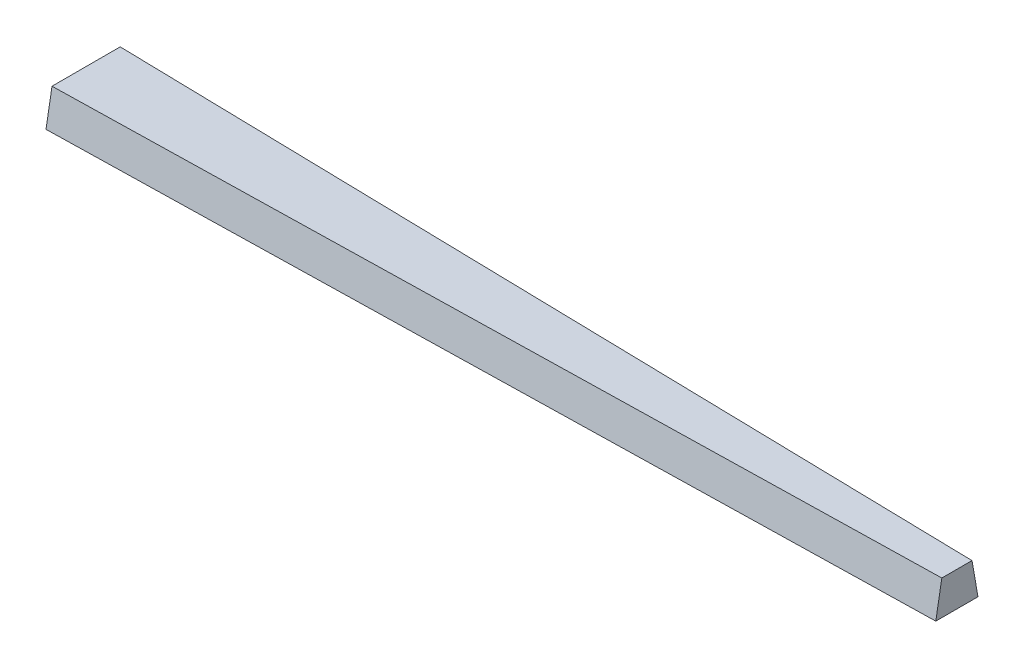
ISO-10303-21;
HEADER;
FILE_DESCRIPTION(('STEP AP214'),'2;1');
FILE_NAME('part.step','',(''),(''),'','','');
FILE_SCHEMA(('AUTOMOTIVE_DESIGN { 1 0 10303 214 1 1 1 1 }'));
ENDSEC;
DATA;
#1=APPLICATION_CONTEXT('core data for automotive mechanical design processes');
#2=APPLICATION_PROTOCOL_DEFINITION('international standard','automotive_design',2000,#1);
#3=PRODUCT_CONTEXT('',#1,'mechanical');
#4=PRODUCT('Part','Part','',(#3));
#5=PRODUCT_RELATED_PRODUCT_CATEGORY('part','',(#4));
#6=PRODUCT_DEFINITION_FORMATION('','',#4);
#7=PRODUCT_DEFINITION_CONTEXT('part definition',#1,'design');
#8=PRODUCT_DEFINITION('design','',#6,#7);
#9=PRODUCT_DEFINITION_SHAPE('','',#8);
#10=(LENGTH_UNIT() NAMED_UNIT(*) SI_UNIT(.MILLI.,.METRE.));
#11=(NAMED_UNIT(*) PLANE_ANGLE_UNIT() SI_UNIT($,.RADIAN.));
#12=(NAMED_UNIT(*) SI_UNIT($,.STERADIAN.) SOLID_ANGLE_UNIT());
#13=UNCERTAINTY_MEASURE_WITH_UNIT(LENGTH_MEASURE(1.E-05),#10,'distance_accuracy_value','');
#14=(GEOMETRIC_REPRESENTATION_CONTEXT(3) GLOBAL_UNCERTAINTY_ASSIGNED_CONTEXT((#13)) GLOBAL_UNIT_ASSIGNED_CONTEXT((#10,
#11,#12)) REPRESENTATION_CONTEXT('',''));
#15=CARTESIAN_POINT('',(0.,0.,0.));
#16=DIRECTION('',(0.,0.,1.));
#17=DIRECTION('',(1.,0.,0.));
#18=AXIS2_PLACEMENT_3D('',#15,#16,#17);
#19=CARTESIAN_POINT('',(0.,19.05,22.225));
#20=DIRECTION('',(1.,0.,0.));
#21=DIRECTION('',(0.,0.,-1.));
#22=AXIS2_PLACEMENT_3D('',#19,#20,#21);
#23=PLANE('',#22);
#24=DIRECTION('',(0.,0.,1.));
#25=VECTOR('',#24,1.);
#26=CARTESIAN_POINT('',(0.,0.,22.225));
#27=LINE('',#26,#25);
#28=CARTESIAN_POINT('',(0.,0.,-22.225));
#29=VERTEX_POINT('',#28);
#30=CARTESIAN_POINT('',(0.,0.,22.225));
#31=VERTEX_POINT('',#30);
#32=EDGE_CURVE('E78',#29,#31,#27,.T.);
#33=ORIENTED_EDGE('',*,*,#32,.T.);
#34=DIRECTION('',(0.,-0.985012196198123,0.172484704657981));
#35=VECTOR('',#34,1.);
#36=CARTESIAN_POINT('',(0.,19.0515272527667,18.8889021687646));
#37=LINE('',#36,#35);
#38=CARTESIAN_POINT('',(0.,19.05,18.8891696047856));
#39=VERTEX_POINT('',#38);
#40=EDGE_CURVE('E11',#31,#39,#37,.F.);
#41=ORIENTED_EDGE('',*,*,#40,.T.);
#42=DIRECTION('',(0.,0.,1.));
#43=VECTOR('',#42,1.);
#44=CARTESIAN_POINT('',(0.,19.05,22.225));
#45=LINE('',#44,#43);
#46=CARTESIAN_POINT('',(0.,19.05,-18.8891696047856));
#47=VERTEX_POINT('',#46);
#48=EDGE_CURVE('E81',#47,#39,#45,.T.);
#49=ORIENTED_EDGE('',*,*,#48,.F.);
#50=DIRECTION('',(0.,0.985012196198123,0.172484704657981));
#51=VECTOR('',#50,1.);
#52=CARTESIAN_POINT('',(0.,19.0515272527667,-18.8889021687646));
#53=LINE('',#52,#51);
#54=EDGE_CURVE('E44',#47,#29,#53,.F.);
#55=ORIENTED_EDGE('',*,*,#54,.T.);
#56=EDGE_LOOP('',(#33,#41,#49,#55));
#57=FACE_BOUND('',#56,.T.);
#58=ADVANCED_FACE('F36',(#57),#23,.F.);
#59=CARTESIAN_POINT('',(482.6,19.05,-11.6946305395506));
#60=DIRECTION('',(-1.,0.,0.));
#61=DIRECTION('',(0.,0.,1.));
#62=AXIS2_PLACEMENT_3D('',#59,#60,#61);
#63=PLANE('',#62);
#64=DIRECTION('',(0.,0.,-1.));
#65=VECTOR('',#64,1.);
#66=CARTESIAN_POINT('',(482.6,19.05,-11.6946305395506));
#67=LINE('',#66,#65);
#68=CARTESIAN_POINT('',(482.6,19.05,8.35880014433619));
#69=VERTEX_POINT('',#68);
#70=CARTESIAN_POINT('',(482.6,19.05,-8.35880014433619));
#71=VERTEX_POINT('',#70);
#72=EDGE_CURVE('E96',#69,#71,#67,.T.);
#73=ORIENTED_EDGE('',*,*,#72,.F.);
#74=DIRECTION('',(0.,0.985012196198123,-0.172484704657981));
#75=VECTOR('',#74,1.);
#76=CARTESIAN_POINT('',(482.6,17.2624223491444,8.67182144940337));
#77=LINE('',#76,#75);
#78=CARTESIAN_POINT('',(482.6,0.,11.6946305395506));
#79=VERTEX_POINT('',#78);
#80=EDGE_CURVE('E59',#69,#79,#77,.F.);
#81=ORIENTED_EDGE('',*,*,#80,.T.);
#82=DIRECTION('',(0.,0.,-1.));
#83=VECTOR('',#82,1.);
#84=CARTESIAN_POINT('',(482.6,0.,-11.6946305395506));
#85=LINE('',#84,#83);
#86=CARTESIAN_POINT('',(482.6,0.,-11.6946305395506));
#87=VERTEX_POINT('',#86);
#88=EDGE_CURVE('E100',#79,#87,#85,.T.);
#89=ORIENTED_EDGE('',*,*,#88,.T.);
#90=DIRECTION('',(0.,-0.985012196198123,-0.172484704657981));
#91=VECTOR('',#90,1.);
#92=CARTESIAN_POINT('',(482.6,17.2624223491444,-8.67182144940337));
#93=LINE('',#92,#91);
#94=EDGE_CURVE('E51',#87,#71,#93,.F.);
#95=ORIENTED_EDGE('',*,*,#94,.T.);
#96=EDGE_LOOP('',(#73,#81,#89,#95));
#97=FACE_BOUND('',#96,.T.);
#98=ADVANCED_FACE('F107',(#97),#63,.F.);
#99=CARTESIAN_POINT('',(0.,19.05,0.));
#100=DIRECTION('',(0.,-1.,0.));
#101=DIRECTION('',(0.,0.,-1.));
#102=AXIS2_PLACEMENT_3D('',#99,#100,#101);
#103=PLANE('',#102);
#104=ORIENTED_EDGE('',*,*,#48,.T.);
#105=DIRECTION('',(0.999762027079909,0.,-0.0218148850345612));
#106=VECTOR('',#105,1.);
#107=CARTESIAN_POINT('',(0.411967003000338,19.05,18.8801804528023));
#108=LINE('',#107,#106);
#109=EDGE_CURVE('E104',#39,#69,#108,.T.);
#110=ORIENTED_EDGE('',*,*,#109,.T.);
#111=ORIENTED_EDGE('',*,*,#72,.T.);
#112=DIRECTION('',(-0.999762027079909,0.,-0.0218148850345612));
#113=VECTOR('',#112,1.);
#114=CARTESIAN_POINT('',(0.411967003000338,19.05,-18.8801804528023));
#115=LINE('',#114,#113);
#116=EDGE_CURVE('E102',#71,#47,#115,.T.);
#117=ORIENTED_EDGE('',*,*,#116,.T.);
#118=EDGE_LOOP('',(#104,#110,#111,#117));
#119=FACE_BOUND('',#118,.T.);
#120=ADVANCED_FACE('F110',(#119),#103,.F.);
#121=CARTESIAN_POINT('',(0.,0.,0.));
#122=DIRECTION('',(0.,-1.,0.));
#123=DIRECTION('',(0.,0.,-1.));
#124=AXIS2_PLACEMENT_3D('',#121,#122,#123);
#125=PLANE('',#124);
#126=DIRECTION('',(-0.999762027079909,0.,-0.0218148850345612));
#127=VECTOR('',#126,1.);
#128=CARTESIAN_POINT('',(0.,0.,-22.225));
#129=LINE('',#128,#127);
#130=EDGE_CURVE('E90',#87,#29,#129,.T.);
#131=ORIENTED_EDGE('',*,*,#130,.F.);
#132=ORIENTED_EDGE('',*,*,#88,.F.);
#133=DIRECTION('',(0.999762027079909,0.,-0.0218148850345612));
#134=VECTOR('',#133,1.);
#135=CARTESIAN_POINT('',(0.,0.,22.225));
#136=LINE('',#135,#134);
#137=EDGE_CURVE('E91',#31,#79,#136,.T.);
#138=ORIENTED_EDGE('',*,*,#137,.F.);
#139=ORIENTED_EDGE('',*,*,#32,.F.);
#140=EDGE_LOOP('',(#131,#132,#138,#139));
#141=FACE_BOUND('',#140,.T.);
#142=ADVANCED_FACE('F88',(#141),#125,.T.);
#143=CARTESIAN_POINT('',(0.411967003000338,19.05,18.8801804528023));
#144=DIRECTION('',(-0.0214880799341551,-0.172444878725174,-0.984784761367784));
#145=DIRECTION('',(0.999762027079909,0.,-0.0218148850345612));
#146=AXIS2_PLACEMENT_3D('',#143,#144,#145);
#147=PLANE('',#146);
#148=ORIENTED_EDGE('',*,*,#40,.F.);
#149=ORIENTED_EDGE('',*,*,#137,.T.);
#150=ORIENTED_EDGE('',*,*,#80,.F.);
#151=ORIENTED_EDGE('',*,*,#109,.F.);
#152=EDGE_LOOP('',(#148,#149,#150,#151));
#153=FACE_BOUND('',#152,.T.);
#154=ADVANCED_FACE('F108',(#153),#147,.F.);
#155=CARTESIAN_POINT('',(0.411967003000338,19.05,-18.8801804528023));
#156=DIRECTION('',(-0.0214880799341551,-0.172444878725174,0.984784761367784));
#157=DIRECTION('',(-0.999762027079909,0.,-0.0218148850345612));
#158=AXIS2_PLACEMENT_3D('',#155,#156,#157);
#159=PLANE('',#158);
#160=ORIENTED_EDGE('',*,*,#94,.F.);
#161=ORIENTED_EDGE('',*,*,#130,.T.);
#162=ORIENTED_EDGE('',*,*,#54,.F.);
#163=ORIENTED_EDGE('',*,*,#116,.F.);
#164=EDGE_LOOP('',(#160,#161,#162,#163));
#165=FACE_BOUND('',#164,.T.);
#166=ADVANCED_FACE('F38',(#165),#159,.F.);
#167=CLOSED_SHELL('',(#58,#98,#120,#142,#154,#166));
#168=MANIFOLD_SOLID_BREP('B2',#167);
#169=ADVANCED_BREP_SHAPE_REPRESENTATION('',(#18,#168),#14);
#170=SHAPE_DEFINITION_REPRESENTATION(#9,#169);
ENDSEC;
END-ISO-10303-21;
